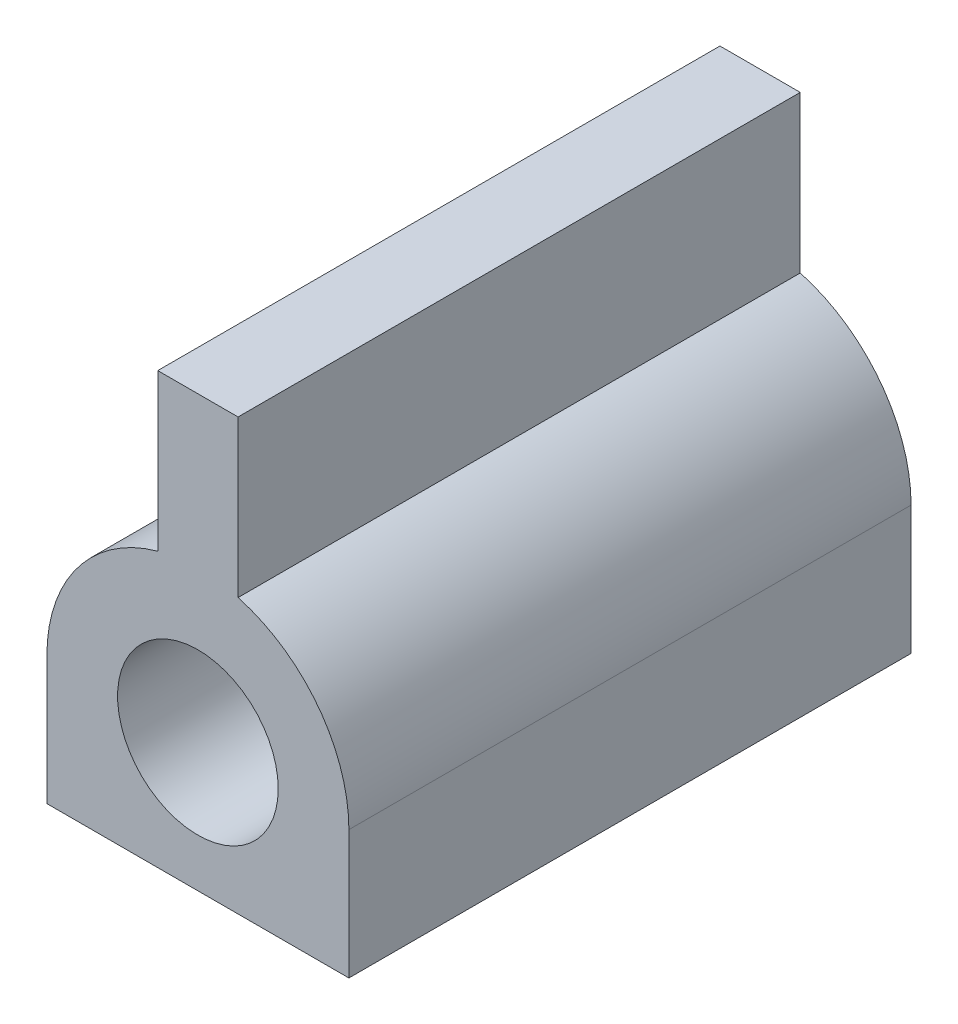
ISO-10303-21;
HEADER;
FILE_DESCRIPTION(('STEP AP214'),'2;1');
FILE_NAME('part.step','',(''),(''),'','','');
FILE_SCHEMA(('AUTOMOTIVE_DESIGN { 1 0 10303 214 1 1 1 1 }'));
ENDSEC;
DATA;
#1=APPLICATION_CONTEXT('core data for automotive mechanical design processes');
#2=APPLICATION_PROTOCOL_DEFINITION('international standard','automotive_design',2000,#1);
#3=PRODUCT_CONTEXT('',#1,'mechanical');
#4=PRODUCT('Part','Part','',(#3));
#5=PRODUCT_RELATED_PRODUCT_CATEGORY('part','',(#4));
#6=PRODUCT_DEFINITION_FORMATION('','',#4);
#7=PRODUCT_DEFINITION_CONTEXT('part definition',#1,'design');
#8=PRODUCT_DEFINITION('design','',#6,#7);
#9=PRODUCT_DEFINITION_SHAPE('','',#8);
#10=(LENGTH_UNIT() NAMED_UNIT(*) SI_UNIT(.MILLI.,.METRE.));
#11=(NAMED_UNIT(*) PLANE_ANGLE_UNIT() SI_UNIT($,.RADIAN.));
#12=(NAMED_UNIT(*) SI_UNIT($,.STERADIAN.) SOLID_ANGLE_UNIT());
#13=UNCERTAINTY_MEASURE_WITH_UNIT(LENGTH_MEASURE(1.E-05),#10,'distance_accuracy_value','');
#14=(GEOMETRIC_REPRESENTATION_CONTEXT(3) GLOBAL_UNCERTAINTY_ASSIGNED_CONTEXT((#13)) GLOBAL_UNIT_ASSIGNED_CONTEXT((#10,
#11,#12)) REPRESENTATION_CONTEXT('',''));
#15=CARTESIAN_POINT('',(0.,0.,0.));
#16=DIRECTION('',(0.,0.,1.));
#17=DIRECTION('',(1.,0.,0.));
#18=AXIS2_PLACEMENT_3D('',#15,#16,#17);
#19=CARTESIAN_POINT('',(0.,0.,22.225));
#20=DIRECTION('',(0.,0.,-1.));
#21=DIRECTION('',(-1.,0.,0.));
#22=AXIS2_PLACEMENT_3D('',#19,#20,#21);
#23=PLANE('',#22);
#24=DIRECTION('',(0.,-1.,0.));
#25=VECTOR('',#24,1.);
#26=CARTESIAN_POINT('',(-11.938,-10.16,22.225));
#27=LINE('',#26,#25);
#28=CARTESIAN_POINT('',(-11.938,0.,22.225));
#29=VERTEX_POINT('',#28);
#30=CARTESIAN_POINT('',(-11.938,-10.16,22.225));
#31=VERTEX_POINT('',#30);
#32=EDGE_CURVE('E146',#29,#31,#27,.T.);
#33=ORIENTED_EDGE('',*,*,#32,.T.);
#34=DIRECTION('',(1.,0.,0.));
#35=VECTOR('',#34,1.);
#36=CARTESIAN_POINT('',(11.938,-10.16,22.225));
#37=LINE('',#36,#35);
#38=CARTESIAN_POINT('',(11.938,-10.16,22.225));
#39=VERTEX_POINT('',#38);
#40=EDGE_CURVE('E94',#31,#39,#37,.T.);
#41=ORIENTED_EDGE('',*,*,#40,.T.);
#42=DIRECTION('',(0.,1.,0.));
#43=VECTOR('',#42,1.);
#44=CARTESIAN_POINT('',(11.938,0.,22.225));
#45=LINE('',#44,#43);
#46=CARTESIAN_POINT('',(11.938,0.,22.225));
#47=VERTEX_POINT('',#46);
#48=EDGE_CURVE('E161',#39,#47,#45,.T.);
#49=ORIENTED_EDGE('',*,*,#48,.T.);
#50=CARTESIAN_POINT('',(0.,0.,22.225));
#51=DIRECTION('',(0.,0.,1.));
#52=DIRECTION('',(-1.,0.,0.));
#53=AXIS2_PLACEMENT_3D('',#50,#51,#52);
#54=CIRCLE('',#53,11.938);
#55=CARTESIAN_POINT('',(3.175,11.5080501823723,22.225));
#56=VERTEX_POINT('',#55);
#57=EDGE_CURVE('E174',#47,#56,#54,.T.);
#58=ORIENTED_EDGE('',*,*,#57,.T.);
#59=DIRECTION('',(0.,1.,0.));
#60=VECTOR('',#59,1.);
#61=CARTESIAN_POINT('',(3.175,23.876,22.225));
#62=LINE('',#61,#60);
#63=CARTESIAN_POINT('',(3.175,23.876,22.225));
#64=VERTEX_POINT('',#63);
#65=EDGE_CURVE('E113',#56,#64,#62,.T.);
#66=ORIENTED_EDGE('',*,*,#65,.T.);
#67=DIRECTION('',(-1.,0.,0.));
#68=VECTOR('',#67,1.);
#69=CARTESIAN_POINT('',(-3.175,23.876,22.225));
#70=LINE('',#69,#68);
#71=CARTESIAN_POINT('',(-3.175,23.876,22.225));
#72=VERTEX_POINT('',#71);
#73=EDGE_CURVE('E107',#64,#72,#70,.T.);
#74=ORIENTED_EDGE('',*,*,#73,.T.);
#75=DIRECTION('',(0.,-1.,0.));
#76=VECTOR('',#75,1.);
#77=CARTESIAN_POINT('',(-3.175,11.5080501823723,22.225));
#78=LINE('',#77,#76);
#79=CARTESIAN_POINT('',(-3.175,11.5080501823723,22.225));
#80=VERTEX_POINT('',#79);
#81=EDGE_CURVE('E111',#72,#80,#78,.T.);
#82=ORIENTED_EDGE('',*,*,#81,.T.);
#83=CARTESIAN_POINT('',(0.,0.,22.225));
#84=DIRECTION('',(0.,0.,1.));
#85=DIRECTION('',(-1.,0.,0.));
#86=AXIS2_PLACEMENT_3D('',#83,#84,#85);
#87=CIRCLE('',#86,11.938);
#88=EDGE_CURVE('E51',#80,#29,#87,.T.);
#89=ORIENTED_EDGE('',*,*,#88,.T.);
#90=EDGE_LOOP('',(#33,#41,#49,#58,#66,#74,#82,#89));
#91=FACE_BOUND('',#90,.T.);
#92=CARTESIAN_POINT('',(0.,0.,22.225));
#93=DIRECTION('',(0.,0.,1.));
#94=DIRECTION('',(1.,0.,0.));
#95=AXIS2_PLACEMENT_3D('',#92,#93,#94);
#96=CIRCLE('',#95,6.35);
#97=CARTESIAN_POINT('',(6.35,0.,22.225));
#98=VERTEX_POINT('',#97);
#99=EDGE_CURVE('E135',#98,#98,#96,.T.);
#100=ORIENTED_EDGE('',*,*,#99,.F.);
#101=EDGE_LOOP('',(#100));
#102=FACE_BOUND('',#101,.T.);
#103=ADVANCED_FACE('F34',(#91,#102),#23,.F.);
#104=CARTESIAN_POINT('',(0.,0.,-22.225));
#105=DIRECTION('',(0.,0.,-1.));
#106=DIRECTION('',(-1.,0.,0.));
#107=AXIS2_PLACEMENT_3D('',#104,#105,#106);
#108=PLANE('',#107);
#109=DIRECTION('',(0.,-1.,0.));
#110=VECTOR('',#109,1.);
#111=CARTESIAN_POINT('',(-11.938,-10.16,-22.225));
#112=LINE('',#111,#110);
#113=CARTESIAN_POINT('',(-11.938,0.,-22.225));
#114=VERTEX_POINT('',#113);
#115=CARTESIAN_POINT('',(-11.938,-10.16,-22.225));
#116=VERTEX_POINT('',#115);
#117=EDGE_CURVE('E131',#114,#116,#112,.T.);
#118=ORIENTED_EDGE('',*,*,#117,.F.);
#119=CARTESIAN_POINT('',(0.,0.,-22.225));
#120=DIRECTION('',(0.,0.,1.));
#121=DIRECTION('',(-1.,0.,0.));
#122=AXIS2_PLACEMENT_3D('',#119,#120,#121);
#123=CIRCLE('',#122,11.938);
#124=CARTESIAN_POINT('',(-3.175,11.5080501823723,-22.225));
#125=VERTEX_POINT('',#124);
#126=EDGE_CURVE('E86',#125,#114,#123,.T.);
#127=ORIENTED_EDGE('',*,*,#126,.F.);
#128=DIRECTION('',(0.,-1.,0.));
#129=VECTOR('',#128,1.);
#130=CARTESIAN_POINT('',(-3.175,11.5080501823723,-22.225));
#131=LINE('',#130,#129);
#132=CARTESIAN_POINT('',(-3.175,23.876,-22.225));
#133=VERTEX_POINT('',#132);
#134=EDGE_CURVE('E80',#133,#125,#131,.T.);
#135=ORIENTED_EDGE('',*,*,#134,.F.);
#136=DIRECTION('',(-1.,0.,0.));
#137=VECTOR('',#136,1.);
#138=CARTESIAN_POINT('',(-3.175,23.876,-22.225));
#139=LINE('',#138,#137);
#140=CARTESIAN_POINT('',(3.175,23.876,-22.225));
#141=VERTEX_POINT('',#140);
#142=EDGE_CURVE('E121',#141,#133,#139,.T.);
#143=ORIENTED_EDGE('',*,*,#142,.F.);
#144=DIRECTION('',(0.,1.,0.));
#145=VECTOR('',#144,1.);
#146=CARTESIAN_POINT('',(3.175,23.876,-22.225));
#147=LINE('',#146,#145);
#148=CARTESIAN_POINT('',(3.175,11.5080501823723,-22.225));
#149=VERTEX_POINT('',#148);
#150=EDGE_CURVE('E141',#149,#141,#147,.T.);
#151=ORIENTED_EDGE('',*,*,#150,.F.);
#152=CARTESIAN_POINT('',(0.,0.,-22.225));
#153=DIRECTION('',(0.,0.,1.));
#154=DIRECTION('',(-1.,0.,0.));
#155=AXIS2_PLACEMENT_3D('',#152,#153,#154);
#156=CIRCLE('',#155,11.938);
#157=CARTESIAN_POINT('',(11.938,0.,-22.225));
#158=VERTEX_POINT('',#157);
#159=EDGE_CURVE('E139',#158,#149,#156,.T.);
#160=ORIENTED_EDGE('',*,*,#159,.F.);
#161=DIRECTION('',(0.,1.,0.));
#162=VECTOR('',#161,1.);
#163=CARTESIAN_POINT('',(11.938,0.,-22.225));
#164=LINE('',#163,#162);
#165=CARTESIAN_POINT('',(11.938,-10.16,-22.225));
#166=VERTEX_POINT('',#165);
#167=EDGE_CURVE('E137',#166,#158,#164,.T.);
#168=ORIENTED_EDGE('',*,*,#167,.F.);
#169=DIRECTION('',(1.,0.,0.));
#170=VECTOR('',#169,1.);
#171=CARTESIAN_POINT('',(11.938,-10.16,-22.225));
#172=LINE('',#171,#170);
#173=EDGE_CURVE('E134',#116,#166,#172,.T.);
#174=ORIENTED_EDGE('',*,*,#173,.F.);
#175=EDGE_LOOP('',(#118,#127,#135,#143,#151,#160,#168,#174));
#176=FACE_BOUND('',#175,.T.);
#177=CARTESIAN_POINT('',(0.,0.,-22.225));
#178=DIRECTION('',(0.,0.,1.));
#179=DIRECTION('',(1.,0.,0.));
#180=AXIS2_PLACEMENT_3D('',#177,#178,#179);
#181=CIRCLE('',#180,6.35);
#182=CARTESIAN_POINT('',(6.35,0.,-22.225));
#183=VERTEX_POINT('',#182);
#184=EDGE_CURVE('E180',#183,#183,#181,.T.);
#185=ORIENTED_EDGE('',*,*,#184,.T.);
#186=EDGE_LOOP('',(#185));
#187=FACE_BOUND('',#186,.T.);
#188=ADVANCED_FACE('F165',(#176,#187),#108,.T.);
#189=CARTESIAN_POINT('',(-11.938,-10.16,22.225));
#190=DIRECTION('',(1.,0.,0.));
#191=DIRECTION('',(0.,1.,0.));
#192=AXIS2_PLACEMENT_3D('',#189,#190,#191);
#193=PLANE('',#192);
#194=ORIENTED_EDGE('',*,*,#117,.T.);
#195=DIRECTION('',(0.,0.,-1.));
#196=VECTOR('',#195,1.);
#197=CARTESIAN_POINT('',(-11.938,-10.16,22.225));
#198=LINE('',#197,#196);
#199=EDGE_CURVE('E11',#31,#116,#198,.T.);
#200=ORIENTED_EDGE('',*,*,#199,.F.);
#201=ORIENTED_EDGE('',*,*,#32,.F.);
#202=DIRECTION('',(0.,0.,-1.));
#203=VECTOR('',#202,1.);
#204=CARTESIAN_POINT('',(-11.938,0.,22.225));
#205=LINE('',#204,#203);
#206=EDGE_CURVE('E127',#29,#114,#205,.T.);
#207=ORIENTED_EDGE('',*,*,#206,.T.);
#208=EDGE_LOOP('',(#194,#200,#201,#207));
#209=FACE_BOUND('',#208,.T.);
#210=ADVANCED_FACE('F36',(#209),#193,.F.);
#211=CARTESIAN_POINT('',(11.938,-10.16,22.225));
#212=DIRECTION('',(0.,1.,0.));
#213=DIRECTION('',(-1.,0.,0.));
#214=AXIS2_PLACEMENT_3D('',#211,#212,#213);
#215=PLANE('',#214);
#216=ORIENTED_EDGE('',*,*,#173,.T.);
#217=DIRECTION('',(0.,0.,-1.));
#218=VECTOR('',#217,1.);
#219=CARTESIAN_POINT('',(11.938,-10.16,22.225));
#220=LINE('',#219,#218);
#221=EDGE_CURVE('E43',#39,#166,#220,.T.);
#222=ORIENTED_EDGE('',*,*,#221,.F.);
#223=ORIENTED_EDGE('',*,*,#40,.F.);
#224=ORIENTED_EDGE('',*,*,#199,.T.);
#225=EDGE_LOOP('',(#216,#222,#223,#224));
#226=FACE_BOUND('',#225,.T.);
#227=ADVANCED_FACE('F208',(#226),#215,.F.);
#228=CARTESIAN_POINT('',(11.938,0.,22.225));
#229=DIRECTION('',(-1.,0.,0.));
#230=DIRECTION('',(0.,0.,1.));
#231=AXIS2_PLACEMENT_3D('',#228,#229,#230);
#232=PLANE('',#231);
#233=ORIENTED_EDGE('',*,*,#167,.T.);
#234=DIRECTION('',(0.,0.,-1.));
#235=VECTOR('',#234,1.);
#236=CARTESIAN_POINT('',(11.938,0.,22.225));
#237=LINE('',#236,#235);
#238=EDGE_CURVE('E153',#47,#158,#237,.T.);
#239=ORIENTED_EDGE('',*,*,#238,.F.);
#240=ORIENTED_EDGE('',*,*,#48,.F.);
#241=ORIENTED_EDGE('',*,*,#221,.T.);
#242=EDGE_LOOP('',(#233,#239,#240,#241));
#243=FACE_BOUND('',#242,.T.);
#244=ADVANCED_FACE('F159',(#243),#232,.F.);
#245=CARTESIAN_POINT('',(0.,0.,22.225));
#246=DIRECTION('',(0.,0.,-1.));
#247=DIRECTION('',(-1.,0.,0.));
#248=AXIS2_PLACEMENT_3D('',#245,#246,#247);
#249=CYLINDRICAL_SURFACE('',#248,11.938);
#250=ORIENTED_EDGE('',*,*,#159,.T.);
#251=DIRECTION('',(0.,0.,-1.));
#252=VECTOR('',#251,1.);
#253=CARTESIAN_POINT('',(3.175,11.5080501823723,22.225));
#254=LINE('',#253,#252);
#255=EDGE_CURVE('E150',#56,#149,#254,.T.);
#256=ORIENTED_EDGE('',*,*,#255,.F.);
#257=ORIENTED_EDGE('',*,*,#57,.F.);
#258=ORIENTED_EDGE('',*,*,#238,.T.);
#259=EDGE_LOOP('',(#250,#256,#257,#258));
#260=FACE_BOUND('',#259,.T.);
#261=ADVANCED_FACE('F170',(#260),#249,.T.);
#262=CARTESIAN_POINT('',(3.175,23.876,22.225));
#263=DIRECTION('',(-1.,0.,0.));
#264=DIRECTION('',(0.,-1.,0.));
#265=AXIS2_PLACEMENT_3D('',#262,#263,#264);
#266=PLANE('',#265);
#267=ORIENTED_EDGE('',*,*,#150,.T.);
#268=DIRECTION('',(0.,0.,-1.));
#269=VECTOR('',#268,1.);
#270=CARTESIAN_POINT('',(3.175,23.876,22.225));
#271=LINE('',#270,#269);
#272=EDGE_CURVE('E122',#64,#141,#271,.T.);
#273=ORIENTED_EDGE('',*,*,#272,.F.);
#274=ORIENTED_EDGE('',*,*,#65,.F.);
#275=ORIENTED_EDGE('',*,*,#255,.T.);
#276=EDGE_LOOP('',(#267,#273,#274,#275));
#277=FACE_BOUND('',#276,.T.);
#278=ADVANCED_FACE('F173',(#277),#266,.F.);
#279=CARTESIAN_POINT('',(-3.175,23.876,22.225));
#280=DIRECTION('',(0.,-1.,0.));
#281=DIRECTION('',(0.,0.,-1.));
#282=AXIS2_PLACEMENT_3D('',#279,#280,#281);
#283=PLANE('',#282);
#284=ORIENTED_EDGE('',*,*,#142,.T.);
#285=DIRECTION('',(0.,0.,-1.));
#286=VECTOR('',#285,1.);
#287=CARTESIAN_POINT('',(-3.175,23.876,22.225));
#288=LINE('',#287,#286);
#289=EDGE_CURVE('E118',#72,#133,#288,.T.);
#290=ORIENTED_EDGE('',*,*,#289,.F.);
#291=ORIENTED_EDGE('',*,*,#73,.F.);
#292=ORIENTED_EDGE('',*,*,#272,.T.);
#293=EDGE_LOOP('',(#284,#290,#291,#292));
#294=FACE_BOUND('',#293,.T.);
#295=ADVANCED_FACE('F119',(#294),#283,.F.);
#296=CARTESIAN_POINT('',(-3.175,11.5080501823723,22.225));
#297=DIRECTION('',(1.,0.,0.));
#298=DIRECTION('',(0.,1.,0.));
#299=AXIS2_PLACEMENT_3D('',#296,#297,#298);
#300=PLANE('',#299);
#301=ORIENTED_EDGE('',*,*,#134,.T.);
#302=DIRECTION('',(0.,0.,-1.));
#303=VECTOR('',#302,1.);
#304=CARTESIAN_POINT('',(-3.175,11.5080501823723,22.225));
#305=LINE('',#304,#303);
#306=EDGE_CURVE('E123',#80,#125,#305,.T.);
#307=ORIENTED_EDGE('',*,*,#306,.F.);
#308=ORIENTED_EDGE('',*,*,#81,.F.);
#309=ORIENTED_EDGE('',*,*,#289,.T.);
#310=EDGE_LOOP('',(#301,#307,#308,#309));
#311=FACE_BOUND('',#310,.T.);
#312=ADVANCED_FACE('F125',(#311),#300,.F.);
#313=CARTESIAN_POINT('',(0.,0.,22.225));
#314=DIRECTION('',(0.,0.,-1.));
#315=DIRECTION('',(-1.,0.,0.));
#316=AXIS2_PLACEMENT_3D('',#313,#314,#315);
#317=CYLINDRICAL_SURFACE('',#316,11.938);
#318=ORIENTED_EDGE('',*,*,#126,.T.);
#319=ORIENTED_EDGE('',*,*,#206,.F.);
#320=ORIENTED_EDGE('',*,*,#88,.F.);
#321=ORIENTED_EDGE('',*,*,#306,.T.);
#322=EDGE_LOOP('',(#318,#319,#320,#321));
#323=FACE_BOUND('',#322,.T.);
#324=ADVANCED_FACE('F196',(#323),#317,.T.);
#325=CARTESIAN_POINT('',(0.,0.,22.225));
#326=DIRECTION('',(0.,0.,-1.));
#327=DIRECTION('',(-1.,0.,0.));
#328=AXIS2_PLACEMENT_3D('',#325,#326,#327);
#329=CYLINDRICAL_SURFACE('',#328,6.35);
#330=ORIENTED_EDGE('',*,*,#99,.T.);
#331=EDGE_LOOP('',(#330));
#332=FACE_BOUND('',#331,.T.);
#333=ORIENTED_EDGE('',*,*,#184,.F.);
#334=EDGE_LOOP('',(#333));
#335=FACE_BOUND('',#334,.T.);
#336=ADVANCED_FACE('F186',(#332,#335),#329,.F.);
#337=CLOSED_SHELL('',(#103,#188,#210,#227,#244,#261,#278,#295,#312,#324,#336));
#338=MANIFOLD_SOLID_BREP('B2',#337);
#339=ADVANCED_BREP_SHAPE_REPRESENTATION('',(#18,#338),#14);
#340=SHAPE_DEFINITION_REPRESENTATION(#9,#339);
ENDSEC;
END-ISO-10303-21;
